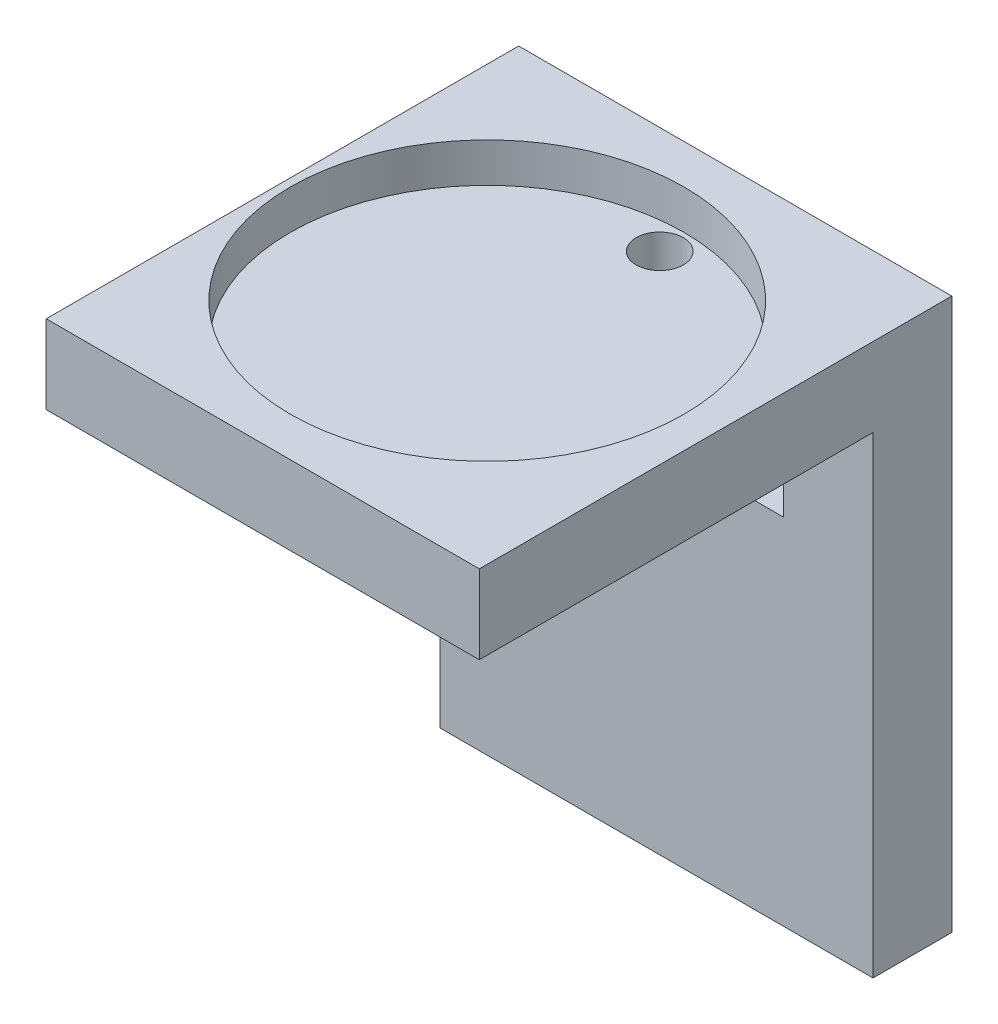
ISO-10303-21;
HEADER;
FILE_DESCRIPTION(('STEP AP214'),'2;1');
FILE_NAME('part.step','',(''),(''),'','','');
FILE_SCHEMA(('AUTOMOTIVE_DESIGN { 1 0 10303 214 1 1 1 1 }'));
ENDSEC;
DATA;
#1=APPLICATION_CONTEXT('core data for automotive mechanical design processes');
#2=APPLICATION_PROTOCOL_DEFINITION('international standard','automotive_design',2000,#1);
#3=PRODUCT_CONTEXT('',#1,'mechanical');
#4=PRODUCT('Part','Part','',(#3));
#5=PRODUCT_RELATED_PRODUCT_CATEGORY('part','',(#4));
#6=PRODUCT_DEFINITION_FORMATION('','',#4);
#7=PRODUCT_DEFINITION_CONTEXT('part definition',#1,'design');
#8=PRODUCT_DEFINITION('design','',#6,#7);
#9=PRODUCT_DEFINITION_SHAPE('','',#8);
#10=(LENGTH_UNIT() NAMED_UNIT(*) SI_UNIT(.MILLI.,.METRE.));
#11=(NAMED_UNIT(*) PLANE_ANGLE_UNIT() SI_UNIT($,.RADIAN.));
#12=(NAMED_UNIT(*) SI_UNIT($,.STERADIAN.) SOLID_ANGLE_UNIT());
#13=UNCERTAINTY_MEASURE_WITH_UNIT(LENGTH_MEASURE(1.E-05),#10,'distance_accuracy_value','');
#14=(GEOMETRIC_REPRESENTATION_CONTEXT(3) GLOBAL_UNCERTAINTY_ASSIGNED_CONTEXT((#13)) GLOBAL_UNIT_ASSIGNED_CONTEXT((#10,
#11,#12)) REPRESENTATION_CONTEXT('',''));
#15=CARTESIAN_POINT('',(0.,0.,0.));
#16=DIRECTION('',(0.,0.,1.));
#17=DIRECTION('',(1.,0.,0.));
#18=AXIS2_PLACEMENT_3D('',#15,#16,#17);
#19=CARTESIAN_POINT('',(0.,530.,0.));
#20=DIRECTION('',(0.,0.,-1.));
#21=DIRECTION('',(-1.,0.,0.));
#22=AXIS2_PLACEMENT_3D('',#19,#20,#21);
#23=PLANE('',#22);
#24=DIRECTION('',(-1.,0.,0.));
#25=VECTOR('',#24,1.);
#26=CARTESIAN_POINT('',(9.99999999999982,260.,0.));
#27=LINE('',#26,#25);
#28=CARTESIAN_POINT('',(448.,260.,0.));
#29=VERTEX_POINT('',#28);
#30=CARTESIAN_POINT('',(338.,260.,0.));
#31=VERTEX_POINT('',#30);
#32=EDGE_CURVE('E234',#29,#31,#27,.T.);
#33=ORIENTED_EDGE('',*,*,#32,.F.);
#34=DIRECTION('',(0.,1.,0.));
#35=VECTOR('',#34,1.);
#36=CARTESIAN_POINT('',(448.,0.,0.));
#37=LINE('',#36,#35);
#38=CARTESIAN_POINT('',(448.,280.,0.));
#39=VERTEX_POINT('',#38);
#40=EDGE_CURVE('E463',#29,#39,#37,.T.);
#41=ORIENTED_EDGE('',*,*,#40,.T.);
#42=DIRECTION('',(-1.,0.,0.));
#43=VECTOR('',#42,1.);
#44=CARTESIAN_POINT('',(0.,280.,0.));
#45=LINE('',#44,#43);
#46=CARTESIAN_POINT('',(338.,280.,0.));
#47=VERTEX_POINT('',#46);
#48=EDGE_CURVE('E170',#39,#47,#45,.T.);
#49=ORIENTED_EDGE('',*,*,#48,.T.);
#50=DIRECTION('',(0.,-1.,0.));
#51=VECTOR('',#50,1.);
#52=CARTESIAN_POINT('',(338.,0.,0.));
#53=LINE('',#52,#51);
#54=EDGE_CURVE('E462',#47,#31,#53,.T.);
#55=ORIENTED_EDGE('',*,*,#54,.T.);
#56=EDGE_LOOP('',(#33,#41,#49,#55));
#57=FACE_BOUND('',#56,.T.);
#58=ADVANCED_FACE('F38',(#57),#23,.F.);
#59=CARTESIAN_POINT('',(0.,530.,-120.));
#60=DIRECTION('',(0.,0.,1.));
#61=DIRECTION('',(1.,0.,0.));
#62=AXIS2_PLACEMENT_3D('',#59,#60,#61);
#63=PLANE('',#62);
#64=DIRECTION('',(0.,1.,0.));
#65=VECTOR('',#64,1.);
#66=CARTESIAN_POINT('',(425.198613037107,530.,-120.));
#67=LINE('',#66,#65);
#68=CARTESIAN_POINT('',(425.198613037107,230.,-120.));
#69=VERTEX_POINT('',#68);
#70=CARTESIAN_POINT('',(425.198613037107,260.,-120.));
#71=VERTEX_POINT('',#70);
#72=EDGE_CURVE('E207',#69,#71,#67,.T.);
#73=ORIENTED_EDGE('',*,*,#72,.T.);
#74=DIRECTION('',(-1.,0.,0.));
#75=VECTOR('',#74,1.);
#76=CARTESIAN_POINT('',(0.,260.,-120.));
#77=LINE('',#76,#75);
#78=CARTESIAN_POINT('',(405.198613037107,260.,-120.));
#79=VERTEX_POINT('',#78);
#80=EDGE_CURVE('E211',#71,#79,#77,.T.);
#81=ORIENTED_EDGE('',*,*,#80,.T.);
#82=DIRECTION('',(0.,-1.,0.));
#83=VECTOR('',#82,1.);
#84=CARTESIAN_POINT('',(405.198613037107,530.000000000001,-120.));
#85=LINE('',#84,#83);
#86=CARTESIAN_POINT('',(405.198613037107,230.,-120.));
#87=VERTEX_POINT('',#86);
#88=EDGE_CURVE('E191',#79,#87,#85,.T.);
#89=ORIENTED_EDGE('',*,*,#88,.T.);
#90=DIRECTION('',(1.,0.,0.));
#91=VECTOR('',#90,1.);
#92=CARTESIAN_POINT('',(0.,230.,-120.));
#93=LINE('',#92,#91);
#94=EDGE_CURVE('E203',#87,#69,#93,.T.);
#95=ORIENTED_EDGE('',*,*,#94,.T.);
#96=EDGE_LOOP('',(#73,#81,#89,#95));
#97=FACE_BOUND('',#96,.T.);
#98=DIRECTION('',(0.,-1.,0.));
#99=VECTOR('',#98,1.);
#100=CARTESIAN_POINT('',(448.,530.,-120.));
#101=LINE('',#100,#99);
#102=CARTESIAN_POINT('',(448.,280.,-120.));
#103=VERTEX_POINT('',#102);
#104=CARTESIAN_POINT('',(448.,140.,-120.));
#105=VERTEX_POINT('',#104);
#106=EDGE_CURVE('E60',#103,#105,#101,.T.);
#107=ORIENTED_EDGE('',*,*,#106,.T.);
#108=DIRECTION('',(-1.,0.,0.));
#109=VECTOR('',#108,1.);
#110=CARTESIAN_POINT('',(338.,140.,-120.));
#111=LINE('',#110,#109);
#112=CARTESIAN_POINT('',(338.,140.,-120.));
#113=VERTEX_POINT('',#112);
#114=EDGE_CURVE('E53',#105,#113,#111,.T.);
#115=ORIENTED_EDGE('',*,*,#114,.T.);
#116=DIRECTION('',(0.,1.,0.));
#117=VECTOR('',#116,1.);
#118=CARTESIAN_POINT('',(338.,530.,-120.));
#119=LINE('',#118,#117);
#120=CARTESIAN_POINT('',(338.,280.,-120.));
#121=VERTEX_POINT('',#120);
#122=EDGE_CURVE('E141',#113,#121,#119,.T.);
#123=ORIENTED_EDGE('',*,*,#122,.T.);
#124=DIRECTION('',(1.,0.,0.));
#125=VECTOR('',#124,1.);
#126=CARTESIAN_POINT('',(0.,280.,-120.));
#127=LINE('',#126,#125);
#128=EDGE_CURVE('E167',#121,#103,#127,.T.);
#129=ORIENTED_EDGE('',*,*,#128,.T.);
#130=EDGE_LOOP('',(#107,#115,#123,#129));
#131=FACE_BOUND('',#130,.T.);
#132=ADVANCED_FACE('F139',(#97,#131),#63,.F.);
#133=CARTESIAN_POINT('',(9.99999999999982,260.,-100.));
#134=DIRECTION('',(0.,1.,0.));
#135=DIRECTION('',(0.,0.,1.));
#136=AXIS2_PLACEMENT_3D('',#133,#134,#135);
#137=PLANE('',#136);
#138=DIRECTION('',(-1.,0.,0.));
#139=VECTOR('',#138,1.);
#140=CARTESIAN_POINT('',(9.99999999999982,260.,-100.));
#141=LINE('',#140,#139);
#142=CARTESIAN_POINT('',(448.,260.,-100.));
#143=VERTEX_POINT('',#142);
#144=CARTESIAN_POINT('',(425.198613037107,260.,-100.));
#145=VERTEX_POINT('',#144);
#146=EDGE_CURVE('E235',#143,#145,#141,.T.);
#147=ORIENTED_EDGE('',*,*,#146,.F.);
#148=DIRECTION('',(0.,0.,1.));
#149=VECTOR('',#148,1.);
#150=CARTESIAN_POINT('',(448.,260.,-100.));
#151=LINE('',#150,#149);
#152=EDGE_CURVE('E155',#143,#29,#151,.T.);
#153=ORIENTED_EDGE('',*,*,#152,.T.);
#154=ORIENTED_EDGE('',*,*,#32,.T.);
#155=DIRECTION('',(0.,0.,-1.));
#156=VECTOR('',#155,1.);
#157=CARTESIAN_POINT('',(338.,260.,-100.));
#158=LINE('',#157,#156);
#159=CARTESIAN_POINT('',(338.,260.,-100.));
#160=VERTEX_POINT('',#159);
#161=EDGE_CURVE('E151',#31,#160,#158,.T.);
#162=ORIENTED_EDGE('',*,*,#161,.T.);
#163=CARTESIAN_POINT('',(385.73779615988,260.,-100.));
#164=VERTEX_POINT('',#163);
#165=EDGE_CURVE('E240',#164,#160,#141,.T.);
#166=ORIENTED_EDGE('',*,*,#165,.F.);
#167=CARTESIAN_POINT('',(391.068650765567,260.,-102.753541205979));
#168=DIRECTION('',(0.,1.,0.));
#169=DIRECTION('',(0.,0.,1.));
#170=AXIS2_PLACEMENT_3D('',#167,#168,#169);
#171=CIRCLE('',#170,6.00000000000001);
#172=CARTESIAN_POINT('',(396.399505371254,260.,-100.));
#173=VERTEX_POINT('',#172);
#174=EDGE_CURVE('E222',#164,#173,#171,.T.);
#175=ORIENTED_EDGE('',*,*,#174,.T.);
#176=CARTESIAN_POINT('',(405.198613037107,260.,-100.));
#177=VERTEX_POINT('',#176);
#178=EDGE_CURVE('E239',#177,#173,#141,.T.);
#179=ORIENTED_EDGE('',*,*,#178,.F.);
#180=DIRECTION('',(0.,0.,1.));
#181=VECTOR('',#180,1.);
#182=CARTESIAN_POINT('',(405.198613037107,260.,-180.));
#183=LINE('',#182,#181);
#184=EDGE_CURVE('E186',#79,#177,#183,.T.);
#185=ORIENTED_EDGE('',*,*,#184,.F.);
#186=ORIENTED_EDGE('',*,*,#80,.F.);
#187=DIRECTION('',(0.,0.,1.));
#188=VECTOR('',#187,1.);
#189=CARTESIAN_POINT('',(425.198613037107,260.,-180.));
#190=LINE('',#189,#188);
#191=EDGE_CURVE('E187',#71,#145,#190,.T.);
#192=ORIENTED_EDGE('',*,*,#191,.T.);
#193=EDGE_LOOP('',(#147,#153,#154,#162,#166,#175,#179,#185,#186,#192));
#194=FACE_BOUND('',#193,.T.);
#195=ADVANCED_FACE('F262',(#194),#137,.F.);
#196=CARTESIAN_POINT('',(0.,0.,-100.));
#197=DIRECTION('',(0.,0.,-1.));
#198=DIRECTION('',(-1.,0.,0.));
#199=AXIS2_PLACEMENT_3D('',#196,#197,#198);
#200=PLANE('',#199);
#201=DIRECTION('',(0.,-1.,0.));
#202=VECTOR('',#201,1.);
#203=CARTESIAN_POINT('',(338.,0.,-100.));
#204=LINE('',#203,#202);
#205=CARTESIAN_POINT('',(338.,140.,-100.));
#206=VERTEX_POINT('',#205);
#207=EDGE_CURVE('E158',#160,#206,#204,.T.);
#208=ORIENTED_EDGE('',*,*,#207,.T.);
#209=DIRECTION('',(1.,0.,0.));
#210=VECTOR('',#209,1.);
#211=CARTESIAN_POINT('',(0.,140.,-100.));
#212=LINE('',#211,#210);
#213=CARTESIAN_POINT('',(448.,140.,-100.));
#214=VERTEX_POINT('',#213);
#215=EDGE_CURVE('E131',#206,#214,#212,.T.);
#216=ORIENTED_EDGE('',*,*,#215,.T.);
#217=DIRECTION('',(0.,1.,0.));
#218=VECTOR('',#217,1.);
#219=CARTESIAN_POINT('',(448.,0.,-100.));
#220=LINE('',#219,#218);
#221=EDGE_CURVE('E150',#214,#143,#220,.T.);
#222=ORIENTED_EDGE('',*,*,#221,.T.);
#223=ORIENTED_EDGE('',*,*,#146,.T.);
#224=DIRECTION('',(0.,1.,0.));
#225=VECTOR('',#224,1.);
#226=CARTESIAN_POINT('',(425.198613037107,260.,-100.));
#227=LINE('',#226,#225);
#228=CARTESIAN_POINT('',(425.198613037107,230.,-100.));
#229=VERTEX_POINT('',#228);
#230=EDGE_CURVE('E182',#229,#145,#227,.T.);
#231=ORIENTED_EDGE('',*,*,#230,.F.);
#232=DIRECTION('',(1.,0.,0.));
#233=VECTOR('',#232,1.);
#234=CARTESIAN_POINT('',(405.198613037107,230.,-100.));
#235=LINE('',#234,#233);
#236=CARTESIAN_POINT('',(405.198613037107,230.,-100.));
#237=VERTEX_POINT('',#236);
#238=EDGE_CURVE('E178',#237,#229,#235,.T.);
#239=ORIENTED_EDGE('',*,*,#238,.F.);
#240=DIRECTION('',(0.,-1.,0.));
#241=VECTOR('',#240,1.);
#242=CARTESIAN_POINT('',(405.198613037107,260.,-100.));
#243=LINE('',#242,#241);
#244=EDGE_CURVE('E174',#177,#237,#243,.T.);
#245=ORIENTED_EDGE('',*,*,#244,.F.);
#246=ORIENTED_EDGE('',*,*,#178,.T.);
#247=DIRECTION('',(0.,1.,0.));
#248=VECTOR('',#247,1.);
#249=CARTESIAN_POINT('',(396.399505371254,270.,-100.));
#250=LINE('',#249,#248);
#251=CARTESIAN_POINT('',(396.399505371254,240.,-100.));
#252=VERTEX_POINT('',#251);
#253=EDGE_CURVE('E46',#173,#252,#250,.F.);
#254=ORIENTED_EDGE('',*,*,#253,.T.);
#255=CARTESIAN_POINT('',(360.126421178399,255.060274861322,-100.));
#256=CARTESIAN_POINT('',(361.197878657836,254.419032390211,-100.));
#257=CARTESIAN_POINT('',(362.269434863806,253.777954686513,-100.));
#258=CARTESIAN_POINT('',(364.412924971985,252.49630881247,-100.));
#259=CARTESIAN_POINT('',(365.484858890459,251.855740669329,-100.));
#260=CARTESIAN_POINT('',(367.630488752694,250.574575155137,-100.));
#261=CARTESIAN_POINT('',(368.704185247754,249.933978707057,-100.));
#262=CARTESIAN_POINT('',(370.852214457874,248.653972938759,-100.));
#263=CARTESIAN_POINT('',(371.92654713922,248.014563561968,-100.));
#264=CARTESIAN_POINT('',(374.091815932928,246.728369276729,-100.));
#265=CARTESIAN_POINT('',(375.182767931682,246.081611079005,-100.));
#266=CARTESIAN_POINT('',(376.820807167571,245.114011310732,-100.));
#267=CARTESIAN_POINT('',(377.367130318578,244.791876619013,-100.));
#268=CARTESIAN_POINT('',(378.460495763885,244.148846448435,-100.));
#269=CARTESIAN_POINT('',(379.007538048034,243.827950952332,-100.));
#270=CARTESIAN_POINT('',(380.102253189481,243.188220561839,-100.));
#271=CARTESIAN_POINT('',(380.649925219889,242.869384253079,-100.));
#272=CARTESIAN_POINT('',(381.746910946908,242.234470876414,-100.));
#273=CARTESIAN_POINT('',(382.296224730925,241.918393959063,-100.));
#274=CARTESIAN_POINT('',(383.122132634373,241.447843664861,-100.));
#275=CARTESIAN_POINT('',(383.397722004285,241.291607928525,-100.));
#276=CARTESIAN_POINT('',(383.94979923929,240.980733354888,-100.));
#277=CARTESIAN_POINT('',(384.226287098778,240.82609450765,-100.));
#278=CARTESIAN_POINT('',(384.780457826636,240.519028861539,-100.));
#279=CARTESIAN_POINT('',(385.05814058683,240.36660186767,-100.));
#280=CARTESIAN_POINT('',(385.615201266701,240.064882298253,-100.));
#281=CARTESIAN_POINT('',(385.894579130322,239.915589619775,-100.));
#282=CARTESIAN_POINT('',(386.289572767964,239.708759749575,-100.));
#283=CARTESIAN_POINT('',(386.404159618117,239.649257693831,-100.));
#284=CARTESIAN_POINT('',(386.633821917763,239.531199071057,-100.));
#285=CARTESIAN_POINT('',(386.748897373535,239.472642516222,-100.));
#286=CARTESIAN_POINT('',(386.979643561682,239.356657059368,-100.));
#287=CARTESIAN_POINT('',(387.095314403583,239.299228374922,-100.));
#288=CARTESIAN_POINT('',(387.327335980886,239.185759791687,-100.));
#289=CARTESIAN_POINT('',(387.443686713391,239.129719886988,-100.));
#290=CARTESIAN_POINT('',(387.677851752691,239.01903955668,-100.));
#291=CARTESIAN_POINT('',(387.795670606751,238.964408725665,-100.));
#292=CARTESIAN_POINT('',(388.032281942103,238.857299924232,-100.));
#293=CARTESIAN_POINT('',(388.151074395436,238.804821892249,-100.));
#294=CARTESIAN_POINT('',(388.389803690398,238.702578993552,-100.));
#295=CARTESIAN_POINT('',(388.509740335521,238.652813670468,-100.));
#296=CARTESIAN_POINT('',(388.75097660094,238.556720101934,-100.));
#297=CARTESIAN_POINT('',(388.872276105686,238.510391567595,-100.));
#298=CARTESIAN_POINT('',(389.146355495025,238.41129853138,-100.));
#299=CARTESIAN_POINT('',(389.299575652032,238.359733092363,-100.));
#300=CARTESIAN_POINT('',(389.608845697831,238.265747452526,-100.));
#301=CARTESIAN_POINT('',(389.764895529865,238.223327068497,-100.));
#302=CARTESIAN_POINT('',(390.077908382799,238.151055558242,-100.));
#303=CARTESIAN_POINT('',(390.234835816911,238.12105444933,-100.));
#304=CARTESIAN_POINT('',(390.550810989415,238.075817169677,-100.));
#305=CARTESIAN_POINT('',(390.709857773928,238.06057456977,-100.));
#306=CARTESIAN_POINT('',(391.030615682914,238.046666356404,-100.));
#307=CARTESIAN_POINT('',(391.19233591884,238.048201239681,-100.));
#308=CARTESIAN_POINT('',(391.514721809055,238.06812239548,-100.));
#309=CARTESIAN_POINT('',(391.675387221797,238.086512400845,-100.));
#310=CARTESIAN_POINT('',(391.996324546034,238.138189762055,-100.));
#311=CARTESIAN_POINT('',(392.156565606907,238.171663152694,-100.));
#312=CARTESIAN_POINT('',(392.394682712106,238.230670555186,-100.));
#313=CARTESIAN_POINT('',(392.473695923936,238.251810802904,-100.));
#314=CARTESIAN_POINT('',(392.630992930848,238.296644495193,-100.));
#315=CARTESIAN_POINT('',(392.709276759837,238.320337820435,-100.));
#316=CARTESIAN_POINT('',(392.924180907974,238.388702743024,-100.));
#317=CARTESIAN_POINT('',(393.060069956764,238.435669654043,-100.));
#318=CARTESIAN_POINT('',(393.329956605548,238.534785184476,-100.));
#319=CARTESIAN_POINT('',(393.463953723686,238.5869350977,-100.));
#320=CARTESIAN_POINT('',(393.73044365505,238.695237558832,-100.));
#321=CARTESIAN_POINT('',(393.862935093841,238.751393468957,-100.));
#322=CARTESIAN_POINT('',(394.126585008044,238.86676224595,-100.));
#323=CARTESIAN_POINT('',(394.257743379267,238.925975349596,-100.));
#324=CARTESIAN_POINT('',(394.519276706254,239.046927907788,-100.));
#325=CARTESIAN_POINT('',(394.649648952298,239.108673201287,-100.));
#326=CARTESIAN_POINT('',(394.909482745218,239.234054249673,-100.));
#327=CARTESIAN_POINT('',(395.038944266417,239.297690057601,-100.));
#328=CARTESIAN_POINT('',(395.426230718866,239.490850177874,-100.));
#329=CARTESIAN_POINT('',(395.682936722096,239.622617399503,-100.));
#330=CARTESIAN_POINT('',(396.067287500562,239.823662648417,-100.));
#331=CARTESIAN_POINT('',(396.195708318572,239.89147254956,-100.));
#332=CARTESIAN_POINT('',(396.452096731169,240.027928193569,-100.));
#333=CARTESIAN_POINT('',(396.580064350657,240.096573889561,-100.));
#334=CARTESIAN_POINT('',(396.963441286154,240.30356866215,-100.));
#335=CARTESIAN_POINT('',(397.218289196608,240.442956759303,-100.));
#336=CARTESIAN_POINT('',(397.726402147551,240.723436738203,-100.));
#337=CARTESIAN_POINT('',(397.979669291996,240.864524818791,-100.));
#338=CARTESIAN_POINT('',(398.485373866238,241.14815542453,-100.));
#339=CARTESIAN_POINT('',(398.7378113284,241.290697892039,-100.));
#340=CARTESIAN_POINT('',(399.436737259299,241.687363977692,-100.));
#341=CARTESIAN_POINT('',(399.882559180209,241.94266122285,-100.));
#342=CARTESIAN_POINT('',(400.772931057322,242.455465427851,-100.));
#343=CARTESIAN_POINT('',(401.217481005543,242.712972401521,-100.));
#344=CARTESIAN_POINT('',(402.105712879323,243.229510181426,-100.));
#345=CARTESIAN_POINT('',(402.549394777222,243.4885410352,-100.));
#346=CARTESIAN_POINT('',(403.43612544612,244.007684539599,-100.));
#347=CARTESIAN_POINT('',(403.879174216388,244.267797191472,-100.));
#348=CARTESIAN_POINT('',(405.208422745229,245.049779282424,-100.));
#349=CARTESIAN_POINT('',(406.093928423389,245.572828195042,-100.));
#350=CARTESIAN_POINT('',(407.863846521047,246.620739965135,-100.));
#351=CARTESIAN_POINT('',(408.748258956698,247.145602795366,-100.));
#352=CARTESIAN_POINT('',(410.479814264632,248.174766842167,-100.));
#353=CARTESIAN_POINT('',(411.326985428426,248.679020466483,-100.));
#354=CARTESIAN_POINT('',(413.020890906364,249.688270137564,-100.));
#355=CARTESIAN_POINT('',(413.867625218343,250.193266187959,-100.));
#356=CARTESIAN_POINT('',(415.559969725693,251.203302889108,-100.));
#357=CARTESIAN_POINT('',(416.405580221927,251.708343035832,-100.));
#358=CARTESIAN_POINT('',(418.096558754609,252.718818857858,-100.));
#359=CARTESIAN_POINT('',(418.941926792326,253.224254531037,-100.));
#360=CARTESIAN_POINT('',(419.787214031686,253.729825150445,-100.));
#361=B_SPLINE_CURVE_WITH_KNOTS('',3,(#255,#256,#257,#258,#259,#260,#261,#262,#263,#264,#265,
#266,#267,#268,#269,#270,#271,#272,#273,#274,#275,#276,#277,#278,#279,#280,#281,#282,#283,#284,
#285,#286,#287,#288,#289,#290,#291,#292,#293,#294,#295,#296,#297,#298,#299,#300,#301,#302,#303,
#304,#305,#306,#307,#308,#309,#310,#311,#312,#313,#314,#315,#316,#317,#318,#319,#320,#321,#322,
#323,#324,#325,#326,#327,#328,#329,#330,#331,#332,#333,#334,#335,#336,#337,#338,#339,#340,#341,
#342,#343,#344,#345,#346,#347,#348,#349,#350,#351,#352,#353,#354,#355,#356,#357,#358,#359,#360),
.UNSPECIFIED.,.F.,.F.,(4,2,2,2,2,2,2,2,2,2,2,2,2,2,2,2,2,2,2,2,2,2,2,2,2,2,2,2,2,2,2,2,2,2,2,2,
2,2,2,2,2,2,2,2,2,2,2,2,2,2,2,2,4),(0.,3.74605369535582,7.49229550249724,11.243120425623,
14.9937617555494,18.7985243975548,20.7011946051881,22.6038382404229,24.5049949676066,
26.4062547827502,27.3566363634843,28.307012027415,29.2573033913351,30.2075634991798,
30.5949046100004,30.9822507131647,31.3696708182037,31.7570892741579,32.1466772927802,
32.5362541622911,32.9257652880742,33.3152436351347,33.8000244544383,34.2847955608749,
34.7635282904429,35.242052378413,35.7263011864384,36.2106572652219,36.7011581065013,
36.9465025656022,37.1918355622723,37.6230140491836,38.0543004408995,38.4859531676899,
38.9176393759057,39.3503841459217,39.7831410685237,40.6487239030692,41.0843957802887,
41.5200433354706,42.3914587137636,43.2611947297825,44.1308964075333,45.6721199069523,
47.2133530574178,48.75463454503,50.2959178114831,53.3812501915766,56.4665364275875,
59.4241930619512,62.3818642101585,65.3367082364946,68.2915365076667),.UNSPECIFIED.);
#362=CARTESIAN_POINT('',(385.73779615988,240.,-100.));
#363=VERTEX_POINT('',#362);
#364=EDGE_CURVE('E238',#252,#363,#361,.F.);
#365=ORIENTED_EDGE('',*,*,#364,.T.);
#366=DIRECTION('',(0.,1.,0.));
#367=VECTOR('',#366,1.);
#368=CARTESIAN_POINT('',(385.73779615988,270.,-100.));
#369=LINE('',#368,#367);
#370=EDGE_CURVE('E11',#363,#164,#369,.T.);
#371=ORIENTED_EDGE('',*,*,#370,.T.);
#372=ORIENTED_EDGE('',*,*,#165,.T.);
#373=EDGE_LOOP('',(#208,#216,#222,#223,#231,#239,#245,#246,#254,#365,#371,#372));
#374=FACE_BOUND('',#373,.T.);
#375=ADVANCED_FACE('F256',(#374),#200,.F.);
#376=CARTESIAN_POINT('',(340.,280.,-100.));
#377=DIRECTION('',(0.,-1.,0.));
#378=DIRECTION('',(0.,0.,-1.));
#379=AXIS2_PLACEMENT_3D('',#376,#377,#378);
#380=PLANE('',#379);
#381=CARTESIAN_POINT('',(390.,280.,-60.));
#382=DIRECTION('',(0.,-1.,0.));
#383=DIRECTION('',(0.,0.,-1.));
#384=AXIS2_PLACEMENT_3D('',#381,#382,#383);
#385=CIRCLE('',#384,50.);
#386=CARTESIAN_POINT('',(390.,280.,-110.));
#387=VERTEX_POINT('',#386);
#388=EDGE_CURVE('E230',#387,#387,#385,.T.);
#389=ORIENTED_EDGE('',*,*,#388,.T.);
#390=EDGE_LOOP('',(#389));
#391=FACE_BOUND('',#390,.T.);
#392=ORIENTED_EDGE('',*,*,#48,.F.);
#393=DIRECTION('',(0.,0.,-1.));
#394=VECTOR('',#393,1.);
#395=CARTESIAN_POINT('',(448.,280.,0.));
#396=LINE('',#395,#394);
#397=EDGE_CURVE('E458',#39,#103,#396,.T.);
#398=ORIENTED_EDGE('',*,*,#397,.T.);
#399=ORIENTED_EDGE('',*,*,#128,.F.);
#400=DIRECTION('',(0.,0.,-1.));
#401=VECTOR('',#400,1.);
#402=CARTESIAN_POINT('',(338.,280.,0.));
#403=LINE('',#402,#401);
#404=EDGE_CURVE('E147',#47,#121,#403,.T.);
#405=ORIENTED_EDGE('',*,*,#404,.F.);
#406=EDGE_LOOP('',(#392,#398,#399,#405));
#407=FACE_BOUND('',#406,.T.);
#408=ADVANCED_FACE('F261',(#391,#407),#380,.F.);
#409=CARTESIAN_POINT('',(390.,270.,-60.));
#410=DIRECTION('',(0.,1.,0.));
#411=DIRECTION('',(0.,0.,1.));
#412=AXIS2_PLACEMENT_3D('',#409,#410,#411);
#413=CYLINDRICAL_SURFACE('',#412,50.);
#414=CARTESIAN_POINT('',(390.,270.,-60.));
#415=DIRECTION('',(0.,1.,0.));
#416=DIRECTION('',(0.,0.,1.));
#417=AXIS2_PLACEMENT_3D('',#414,#415,#416);
#418=CIRCLE('',#417,50.);
#419=CARTESIAN_POINT('',(390.,270.,-9.99999999999997));
#420=VERTEX_POINT('',#419);
#421=EDGE_CURVE('E226',#420,#420,#418,.T.);
#422=ORIENTED_EDGE('',*,*,#421,.F.);
#423=EDGE_LOOP('',(#422));
#424=FACE_BOUND('',#423,.T.);
#425=ORIENTED_EDGE('',*,*,#388,.F.);
#426=EDGE_LOOP('',(#425));
#427=FACE_BOUND('',#426,.T.);
#428=ADVANCED_FACE('F315',(#424,#427),#413,.F.);
#429=CARTESIAN_POINT('',(390.,270.,-60.));
#430=DIRECTION('',(0.,1.,0.));
#431=DIRECTION('',(0.,0.,1.));
#432=AXIS2_PLACEMENT_3D('',#429,#430,#431);
#433=PLANE('',#432);
#434=CARTESIAN_POINT('',(391.068650765567,270.,-102.753541205979));
#435=DIRECTION('',(0.,1.,0.));
#436=DIRECTION('',(0.,0.,1.));
#437=AXIS2_PLACEMENT_3D('',#434,#435,#436);
#438=CIRCLE('',#437,6.00000000000001);
#439=CARTESIAN_POINT('',(391.068650765567,270.,-96.7535412059793));
#440=VERTEX_POINT('',#439);
#441=EDGE_CURVE('E215',#440,#440,#438,.T.);
#442=ORIENTED_EDGE('',*,*,#441,.F.);
#443=EDGE_LOOP('',(#442));
#444=FACE_BOUND('',#443,.T.);
#445=ORIENTED_EDGE('',*,*,#421,.T.);
#446=EDGE_LOOP('',(#445));
#447=FACE_BOUND('',#446,.T.);
#448=ADVANCED_FACE('F310',(#444,#447),#433,.T.);
#449=CARTESIAN_POINT('',(391.068650765567,270.,-102.753541205979));
#450=DIRECTION('',(0.,1.,0.));
#451=DIRECTION('',(0.,0.,1.));
#452=AXIS2_PLACEMENT_3D('',#449,#450,#451);
#453=CYLINDRICAL_SURFACE('',#452,6.00000000000001);
#454=ORIENTED_EDGE('',*,*,#441,.T.);
#455=EDGE_LOOP('',(#454));
#456=FACE_BOUND('',#455,.T.);
#457=CARTESIAN_POINT('',(391.068650765567,240.,-102.753541205979));
#458=DIRECTION('',(0.,1.,0.));
#459=DIRECTION('',(0.,0.,1.));
#460=AXIS2_PLACEMENT_3D('',#457,#458,#459);
#461=CIRCLE('',#460,6.00000000000001);
#462=EDGE_CURVE('E219',#252,#363,#461,.T.);
#463=ORIENTED_EDGE('',*,*,#462,.F.);
#464=ORIENTED_EDGE('',*,*,#253,.F.);
#465=ORIENTED_EDGE('',*,*,#174,.F.);
#466=ORIENTED_EDGE('',*,*,#370,.F.);
#467=EDGE_LOOP('',(#463,#464,#465,#466));
#468=FACE_BOUND('',#467,.T.);
#469=ADVANCED_FACE('F296',(#456,#468),#453,.F.);
#470=CARTESIAN_POINT('',(391.068650765567,240.,-102.753541205979));
#471=DIRECTION('',(0.,1.,0.));
#472=DIRECTION('',(0.,0.,1.));
#473=AXIS2_PLACEMENT_3D('',#470,#471,#472);
#474=CONICAL_SURFACE('',#473,6.00000000000001,1.02974425867666);
#475=CARTESIAN_POINT('',(391.068650765567,236.394836285835,-102.753541205979));
#476=VERTEX_POINT('',#475);
#477=VERTEX_LOOP('',#476);
#478=FACE_BOUND('',#477,.T.);
#479=ORIENTED_EDGE('',*,*,#462,.T.);
#480=ORIENTED_EDGE('',*,*,#364,.F.);
#481=EDGE_LOOP('',(#479,#480));
#482=FACE_BOUND('',#481,.T.);
#483=ADVANCED_FACE('F252',(#478,#482),#474,.F.);
#484=CARTESIAN_POINT('',(425.198613037107,260.,-180.));
#485=DIRECTION('',(1.,0.,0.));
#486=DIRECTION('',(0.,0.,-1.));
#487=AXIS2_PLACEMENT_3D('',#484,#485,#486);
#488=PLANE('',#487);
#489=DIRECTION('',(0.,0.,1.));
#490=VECTOR('',#489,1.);
#491=CARTESIAN_POINT('',(425.198613037107,230.,-180.));
#492=LINE('',#491,#490);
#493=EDGE_CURVE('E192',#69,#229,#492,.T.);
#494=ORIENTED_EDGE('',*,*,#493,.T.);
#495=ORIENTED_EDGE('',*,*,#230,.T.);
#496=ORIENTED_EDGE('',*,*,#191,.F.);
#497=ORIENTED_EDGE('',*,*,#72,.F.);
#498=EDGE_LOOP('',(#494,#495,#496,#497));
#499=FACE_BOUND('',#498,.T.);
#500=ADVANCED_FACE('F278',(#499),#488,.F.);
#501=CARTESIAN_POINT('',(405.198613037107,230.,-180.));
#502=DIRECTION('',(0.,-1.,0.));
#503=DIRECTION('',(0.,0.,-1.));
#504=AXIS2_PLACEMENT_3D('',#501,#502,#503);
#505=PLANE('',#504);
#506=DIRECTION('',(0.,0.,1.));
#507=VECTOR('',#506,1.);
#508=CARTESIAN_POINT('',(405.198613037107,230.,-180.));
#509=LINE('',#508,#507);
#510=EDGE_CURVE('E195',#87,#237,#509,.T.);
#511=ORIENTED_EDGE('',*,*,#510,.T.);
#512=ORIENTED_EDGE('',*,*,#238,.T.);
#513=ORIENTED_EDGE('',*,*,#493,.F.);
#514=ORIENTED_EDGE('',*,*,#94,.F.);
#515=EDGE_LOOP('',(#511,#512,#513,#514));
#516=FACE_BOUND('',#515,.T.);
#517=ADVANCED_FACE('F280',(#516),#505,.F.);
#518=CARTESIAN_POINT('',(405.198613037107,260.,-180.));
#519=DIRECTION('',(-1.,0.,0.));
#520=DIRECTION('',(0.,-1.,0.));
#521=AXIS2_PLACEMENT_3D('',#518,#519,#520);
#522=PLANE('',#521);
#523=ORIENTED_EDGE('',*,*,#184,.T.);
#524=ORIENTED_EDGE('',*,*,#244,.T.);
#525=ORIENTED_EDGE('',*,*,#510,.F.);
#526=ORIENTED_EDGE('',*,*,#88,.F.);
#527=EDGE_LOOP('',(#523,#524,#525,#526));
#528=FACE_BOUND('',#527,.T.);
#529=ADVANCED_FACE('F290',(#528),#522,.F.);
#530=CARTESIAN_POINT('',(338.,0.,0.));
#531=DIRECTION('',(1.,0.,0.));
#532=DIRECTION('',(0.,0.,-1.));
#533=AXIS2_PLACEMENT_3D('',#530,#531,#532);
#534=PLANE('',#533);
#535=ORIENTED_EDGE('',*,*,#122,.F.);
#536=DIRECTION('',(0.,0.,1.));
#537=VECTOR('',#536,1.);
#538=CARTESIAN_POINT('',(338.,140.,-120.));
#539=LINE('',#538,#537);
#540=EDGE_CURVE('E128',#113,#206,#539,.T.);
#541=ORIENTED_EDGE('',*,*,#540,.T.);
#542=ORIENTED_EDGE('',*,*,#207,.F.);
#543=ORIENTED_EDGE('',*,*,#161,.F.);
#544=ORIENTED_EDGE('',*,*,#54,.F.);
#545=ORIENTED_EDGE('',*,*,#404,.T.);
#546=EDGE_LOOP('',(#535,#541,#542,#543,#544,#545));
#547=FACE_BOUND('',#546,.T.);
#548=ADVANCED_FACE('F145',(#547),#534,.F.);
#549=CARTESIAN_POINT('',(448.,0.,0.));
#550=DIRECTION('',(-1.,0.,0.));
#551=DIRECTION('',(0.,0.,1.));
#552=AXIS2_PLACEMENT_3D('',#549,#550,#551);
#553=PLANE('',#552);
#554=ORIENTED_EDGE('',*,*,#221,.F.);
#555=DIRECTION('',(0.,0.,1.));
#556=VECTOR('',#555,1.);
#557=CARTESIAN_POINT('',(448.,140.,-120.));
#558=LINE('',#557,#556);
#559=EDGE_CURVE('E136',#105,#214,#558,.T.);
#560=ORIENTED_EDGE('',*,*,#559,.F.);
#561=ORIENTED_EDGE('',*,*,#106,.F.);
#562=ORIENTED_EDGE('',*,*,#397,.F.);
#563=ORIENTED_EDGE('',*,*,#40,.F.);
#564=ORIENTED_EDGE('',*,*,#152,.F.);
#565=EDGE_LOOP('',(#554,#560,#561,#562,#563,#564));
#566=FACE_BOUND('',#565,.T.);
#567=ADVANCED_FACE('F324',(#566),#553,.F.);
#568=CARTESIAN_POINT('',(338.,140.,-120.));
#569=DIRECTION('',(0.,1.,0.));
#570=DIRECTION('',(0.,0.,1.));
#571=AXIS2_PLACEMENT_3D('',#568,#569,#570);
#572=PLANE('',#571);
#573=ORIENTED_EDGE('',*,*,#540,.F.);
#574=ORIENTED_EDGE('',*,*,#114,.F.);
#575=ORIENTED_EDGE('',*,*,#559,.T.);
#576=ORIENTED_EDGE('',*,*,#215,.F.);
#577=EDGE_LOOP('',(#573,#574,#575,#576));
#578=FACE_BOUND('',#577,.T.);
#579=ADVANCED_FACE('F129',(#578),#572,.F.);
#580=CLOSED_SHELL('',(#58,#132,#195,#375,#408,#428,#448,#469,#483,#500,#517,#529,#548,#567,#579));
#581=MANIFOLD_SOLID_BREP('B2',#580);
#582=ADVANCED_BREP_SHAPE_REPRESENTATION('',(#18,#581),#14);
#583=SHAPE_DEFINITION_REPRESENTATION(#9,#582);
ENDSEC;
END-ISO-10303-21;
